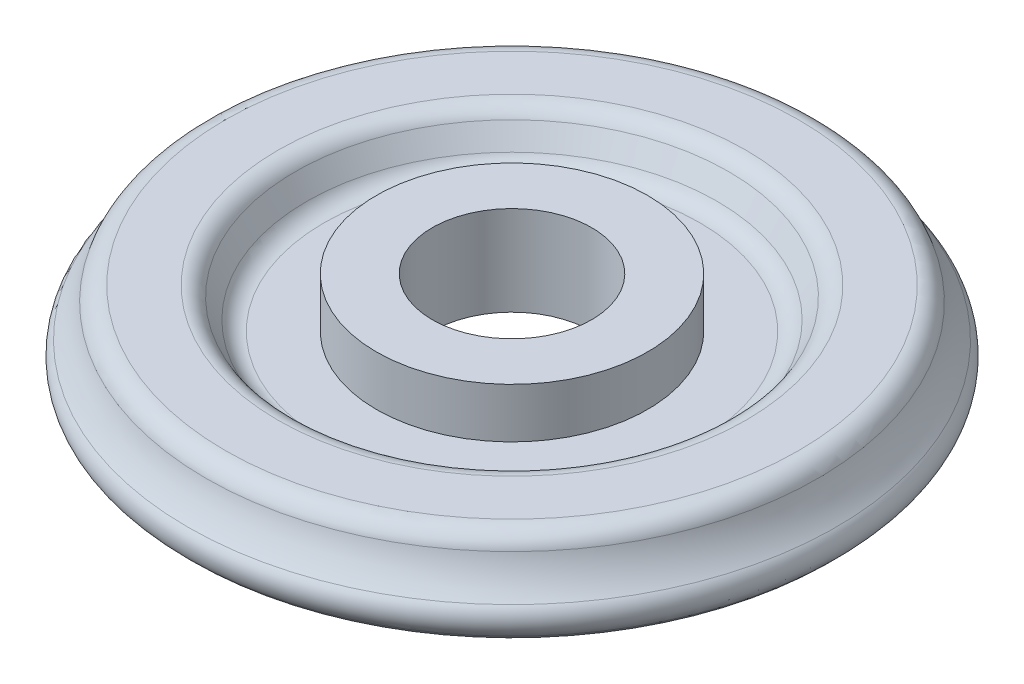
ISO-10303-21;
HEADER;
FILE_DESCRIPTION(('STEP AP214'),'2;1');
FILE_NAME('part.step','',(''),(''),'','','');
FILE_SCHEMA(('AUTOMOTIVE_DESIGN { 1 0 10303 214 1 1 1 1 }'));
ENDSEC;
DATA;
#1=APPLICATION_CONTEXT('core data for automotive mechanical design processes');
#2=APPLICATION_PROTOCOL_DEFINITION('international standard','automotive_design',2000,#1);
#3=PRODUCT_CONTEXT('',#1,'mechanical');
#4=PRODUCT('Part','Part','',(#3));
#5=PRODUCT_RELATED_PRODUCT_CATEGORY('part','',(#4));
#6=PRODUCT_DEFINITION_FORMATION('','',#4);
#7=PRODUCT_DEFINITION_CONTEXT('part definition',#1,'design');
#8=PRODUCT_DEFINITION('design','',#6,#7);
#9=PRODUCT_DEFINITION_SHAPE('','',#8);
#10=(LENGTH_UNIT() NAMED_UNIT(*) SI_UNIT(.MILLI.,.METRE.));
#11=(NAMED_UNIT(*) PLANE_ANGLE_UNIT() SI_UNIT($,.RADIAN.));
#12=(NAMED_UNIT(*) SI_UNIT($,.STERADIAN.) SOLID_ANGLE_UNIT());
#13=UNCERTAINTY_MEASURE_WITH_UNIT(LENGTH_MEASURE(1.E-05),#10,'distance_accuracy_value','');
#14=(GEOMETRIC_REPRESENTATION_CONTEXT(3) GLOBAL_UNCERTAINTY_ASSIGNED_CONTEXT((#13)) GLOBAL_UNIT_ASSIGNED_CONTEXT((#10,
#11,#12)) REPRESENTATION_CONTEXT('',''));
#15=CARTESIAN_POINT('',(0.,0.,0.));
#16=DIRECTION('',(0.,0.,1.));
#17=DIRECTION('',(1.,0.,0.));
#18=AXIS2_PLACEMENT_3D('',#15,#16,#17);
#19=CARTESIAN_POINT('',(0.,7.14375,0.));
#20=DIRECTION('',(0.,1.,0.));
#21=DIRECTION('',(0.,0.,1.));
#22=AXIS2_PLACEMENT_3D('',#19,#20,#21);
#23=PLANE('',#22);
#24=CARTESIAN_POINT('',(0.,7.14375,0.));
#25=DIRECTION('',(0.,1.,0.));
#26=DIRECTION('',(0.,0.,1.));
#27=AXIS2_PLACEMENT_3D('',#24,#25,#26);
#28=CIRCLE('',#27,10.795);
#29=CARTESIAN_POINT('',(0.,7.14375,10.795));
#30=VERTEX_POINT('',#29);
#31=EDGE_CURVE('E66',#30,#30,#28,.T.);
#32=ORIENTED_EDGE('',*,*,#31,.T.);
#33=EDGE_LOOP('',(#32));
#34=FACE_BOUND('',#33,.T.);
#35=CARTESIAN_POINT('',(0.,7.14375,0.));
#36=DIRECTION('',(0.,1.,0.));
#37=DIRECTION('',(0.,0.,1.));
#38=AXIS2_PLACEMENT_3D('',#35,#36,#37);
#39=CIRCLE('',#38,6.35);
#40=CARTESIAN_POINT('',(0.,7.14375,6.35));
#41=VERTEX_POINT('',#40);
#42=EDGE_CURVE('E72',#41,#41,#39,.T.);
#43=ORIENTED_EDGE('',*,*,#42,.F.);
#44=EDGE_LOOP('',(#43));
#45=FACE_BOUND('',#44,.T.);
#46=ADVANCED_FACE('F28',(#34,#45),#23,.T.);
#47=CARTESIAN_POINT('',(0.,0.,0.));
#48=DIRECTION('',(0.,1.,0.));
#49=DIRECTION('',(0.,0.,1.));
#50=AXIS2_PLACEMENT_3D('',#47,#48,#49);
#51=PLANE('',#50);
#52=CARTESIAN_POINT('',(0.,0.,0.));
#53=DIRECTION('',(0.,1.,0.));
#54=DIRECTION('',(0.,0.,1.));
#55=AXIS2_PLACEMENT_3D('',#52,#53,#54);
#56=CIRCLE('',#55,25.4);
#57=CARTESIAN_POINT('',(0.,0.,25.4));
#58=VERTEX_POINT('',#57);
#59=EDGE_CURVE('E63',#58,#58,#56,.T.);
#60=ORIENTED_EDGE('',*,*,#59,.F.);
#61=EDGE_LOOP('',(#60));
#62=FACE_BOUND('',#61,.T.);
#63=CARTESIAN_POINT('',(0.,0.,0.));
#64=DIRECTION('',(0.,1.,0.));
#65=DIRECTION('',(0.,0.,1.));
#66=AXIS2_PLACEMENT_3D('',#63,#64,#65);
#67=CIRCLE('',#66,6.35);
#68=CARTESIAN_POINT('',(0.,0.,6.35));
#69=VERTEX_POINT('',#68);
#70=EDGE_CURVE('E69',#69,#69,#67,.T.);
#71=ORIENTED_EDGE('',*,*,#70,.T.);
#72=EDGE_LOOP('',(#71));
#73=FACE_BOUND('',#72,.T.);
#74=ADVANCED_FACE('F79',(#62,#73),#51,.F.);
#75=CARTESIAN_POINT('',(0.,3.175,0.));
#76=DIRECTION('',(0.,-1.,0.));
#77=DIRECTION('',(0.,0.,-1.));
#78=AXIS2_PLACEMENT_3D('',#75,#76,#77);
#79=PLANE('',#78);
#80=CARTESIAN_POINT('',(0.,3.175,0.));
#81=DIRECTION('',(0.,-1.,0.));
#82=DIRECTION('',(0.,0.,-1.));
#83=AXIS2_PLACEMENT_3D('',#80,#81,#82);
#84=CIRCLE('',#83,14.9584564476615);
#85=CARTESIAN_POINT('',(0.,3.175,-14.9584564476615));
#86=VERTEX_POINT('',#85);
#87=EDGE_CURVE('E43',#86,#86,#84,.F.);
#88=ORIENTED_EDGE('',*,*,#87,.T.);
#89=EDGE_LOOP('',(#88));
#90=FACE_BOUND('',#89,.T.);
#91=CARTESIAN_POINT('',(0.,3.175,0.));
#92=DIRECTION('',(0.,-1.,0.));
#93=DIRECTION('',(0.,0.,-1.));
#94=AXIS2_PLACEMENT_3D('',#91,#92,#93);
#95=CIRCLE('',#94,10.795);
#96=CARTESIAN_POINT('',(0.,3.175,-10.795));
#97=VERTEX_POINT('',#96);
#98=EDGE_CURVE('E10',#97,#97,#95,.F.);
#99=ORIENTED_EDGE('',*,*,#98,.F.);
#100=EDGE_LOOP('',(#99));
#101=FACE_BOUND('',#100,.T.);
#102=ADVANCED_FACE('F85',(#90,#101),#79,.F.);
#103=CARTESIAN_POINT('',(0.,0.,0.));
#104=DIRECTION('',(0.,1.,0.));
#105=DIRECTION('',(0.,0.,1.));
#106=AXIS2_PLACEMENT_3D('',#103,#104,#105);
#107=CONICAL_SURFACE('',#106,25.4,0.785398163397446);
#108=CARTESIAN_POINT('',(0.,0.371975840456725,0.));
#109=DIRECTION('',(0.,-1.,0.));
#110=DIRECTION('',(0.,0.,-1.));
#111=AXIS2_PLACEMENT_3D('',#108,#109,#110);
#112=CIRCLE('',#111,25.7719758404567);
#113=CARTESIAN_POINT('',(0.,0.371975840456725,-25.7719758404567));
#114=VERTEX_POINT('',#113);
#115=EDGE_CURVE('E54',#114,#114,#112,.T.);
#116=ORIENTED_EDGE('',*,*,#115,.T.);
#117=EDGE_LOOP('',(#116));
#118=FACE_BOUND('',#117,.T.);
#119=ORIENTED_EDGE('',*,*,#59,.T.);
#120=EDGE_LOOP('',(#119));
#121=FACE_BOUND('',#120,.T.);
#122=ADVANCED_FACE('F96',(#118,#121),#107,.T.);
#123=CARTESIAN_POINT('',(0.,6.9068235829241,0.));
#124=DIRECTION('',(0.,1.,0.));
#125=DIRECTION('',(0.,0.,1.));
#126=AXIS2_PLACEMENT_3D('',#123,#124,#125);
#127=TOROIDAL_SURFACE('',#126,30.4555393048735,6.35);
#128=CARTESIAN_POINT('',(0.,2.57697100105712,0.));
#129=DIRECTION('',(0.,1.,0.));
#130=DIRECTION('',(0.,0.,1.));
#131=AXIS2_PLACEMENT_3D('',#128,#129,#130);
#132=CIRCLE('',#131,25.8106629212332);
#133=CARTESIAN_POINT('',(0.,2.57697100105712,25.8106629212332));
#134=VERTEX_POINT('',#133);
#135=EDGE_CURVE('E57',#134,#134,#132,.T.);
#136=ORIENTED_EDGE('',*,*,#135,.T.);
#137=EDGE_LOOP('',(#136));
#138=FACE_BOUND('',#137,.T.);
#139=CARTESIAN_POINT('',(0.,5.19136471658482,0.));
#140=DIRECTION('',(0.,1.,0.));
#141=DIRECTION('',(0.,0.,1.));
#142=AXIS2_PLACEMENT_3D('',#139,#140,#141);
#143=CIRCLE('',#142,24.3416452202579);
#144=CARTESIAN_POINT('',(0.,5.19136471658482,24.3416452202579));
#145=VERTEX_POINT('',#144);
#146=EDGE_CURVE('E60',#145,#145,#143,.F.);
#147=ORIENTED_EDGE('',*,*,#146,.T.);
#148=EDGE_LOOP('',(#147));
#149=FACE_BOUND('',#148,.T.);
#150=ADVANCED_FACE('F105',(#138,#149),#127,.F.);
#151=CARTESIAN_POINT('',(24.13,6.35,0.));
#152=DIRECTION('',(0.,-1.,0.));
#153=DIRECTION('',(0.,0.,-1.));
#154=AXIS2_PLACEMENT_3D('',#151,#152,#153);
#155=PLANE('',#154);
#156=CARTESIAN_POINT('',(0.,6.35,0.));
#157=DIRECTION('',(0.,-1.,0.));
#158=DIRECTION('',(0.,0.,-1.));
#159=AXIS2_PLACEMENT_3D('',#156,#157,#158);
#160=CIRCLE('',#159,22.813171699104);
#161=CARTESIAN_POINT('',(0.,6.35,-22.813171699104));
#162=VERTEX_POINT('',#161);
#163=EDGE_CURVE('E48',#162,#162,#160,.F.);
#164=ORIENTED_EDGE('',*,*,#163,.T.);
#165=EDGE_LOOP('',(#164));
#166=FACE_BOUND('',#165,.T.);
#167=CARTESIAN_POINT('',(0.,6.35,0.));
#168=DIRECTION('',(0.,-1.,0.));
#169=DIRECTION('',(0.,0.,-1.));
#170=AXIS2_PLACEMENT_3D('',#167,#168,#169);
#171=CIRCLE('',#170,18.6246306570156);
#172=CARTESIAN_POINT('',(0.,6.35,-18.6246306570156));
#173=VERTEX_POINT('',#172);
#174=EDGE_CURVE('E51',#173,#173,#171,.T.);
#175=ORIENTED_EDGE('',*,*,#174,.T.);
#176=EDGE_LOOP('',(#175));
#177=FACE_BOUND('',#176,.T.);
#178=ADVANCED_FACE('F102',(#166,#177),#155,.F.);
#179=CARTESIAN_POINT('',(0.,6.35,0.));
#180=DIRECTION('',(0.,1.,0.));
#181=DIRECTION('',(0.,0.,1.));
#182=AXIS2_PLACEMENT_3D('',#179,#180,#181);
#183=CONICAL_SURFACE('',#182,17.708087104677,0.523598775598296);
#184=CARTESIAN_POINT('',(0.,3.96875,0.));
#185=DIRECTION('',(0.,1.,0.));
#186=DIRECTION('',(0.,0.,1.));
#187=AXIS2_PLACEMENT_3D('',#184,#185,#186);
#188=CIRCLE('',#187,16.3332717761693);
#189=CARTESIAN_POINT('',(0.,3.96875,16.3332717761693));
#190=VERTEX_POINT('',#189);
#191=EDGE_CURVE('E35',#190,#190,#188,.F.);
#192=ORIENTED_EDGE('',*,*,#191,.T.);
#193=EDGE_LOOP('',(#192));
#194=FACE_BOUND('',#193,.T.);
#195=CARTESIAN_POINT('',(0.,5.55625,0.));
#196=DIRECTION('',(0.,-1.,0.));
#197=DIRECTION('',(0.,0.,-1.));
#198=AXIS2_PLACEMENT_3D('',#195,#196,#197);
#199=CIRCLE('',#198,17.2498153285078);
#200=CARTESIAN_POINT('',(0.,5.55625,-17.2498153285078));
#201=VERTEX_POINT('',#200);
#202=EDGE_CURVE('E39',#201,#201,#199,.F.);
#203=ORIENTED_EDGE('',*,*,#202,.T.);
#204=EDGE_LOOP('',(#203));
#205=FACE_BOUND('',#204,.T.);
#206=ADVANCED_FACE('F98',(#194,#205),#183,.F.);
#207=CARTESIAN_POINT('',(0.,1.49450785559037,0.));
#208=DIRECTION('',(0.,-1.,0.));
#209=DIRECTION('',(0.,0.,-1.));
#210=AXIS2_PLACEMENT_3D('',#207,#208,#209);
#211=TOROIDAL_SURFACE('',#210,24.6494438253231,1.5875);
#212=ORIENTED_EDGE('',*,*,#115,.F.);
#213=EDGE_LOOP('',(#212));
#214=FACE_BOUND('',#213,.T.);
#215=ORIENTED_EDGE('',*,*,#135,.F.);
#216=EDGE_LOOP('',(#215));
#217=FACE_BOUND('',#216,.T.);
#218=ADVANCED_FACE('F101',(#214,#217),#211,.T.);
#219=CARTESIAN_POINT('',(0.,4.7625,0.));
#220=DIRECTION('',(0.,1.,0.));
#221=DIRECTION('',(0.,0.,1.));
#222=AXIS2_PLACEMENT_3D('',#219,#220,#221);
#223=TOROIDAL_SURFACE('',#222,22.813171699104,1.5875);
#224=ORIENTED_EDGE('',*,*,#146,.F.);
#225=EDGE_LOOP('',(#224));
#226=FACE_BOUND('',#225,.T.);
#227=ORIENTED_EDGE('',*,*,#163,.F.);
#228=EDGE_LOOP('',(#227));
#229=FACE_BOUND('',#228,.T.);
#230=ADVANCED_FACE('F115',(#226,#229),#223,.T.);
#231=CARTESIAN_POINT('',(0.,4.7625,0.));
#232=DIRECTION('',(0.,-1.,0.));
#233=DIRECTION('',(0.,0.,-1.));
#234=AXIS2_PLACEMENT_3D('',#231,#232,#233);
#235=TOROIDAL_SURFACE('',#234,14.9584564476615,1.5875);
#236=ORIENTED_EDGE('',*,*,#191,.F.);
#237=EDGE_LOOP('',(#236));
#238=FACE_BOUND('',#237,.T.);
#239=ORIENTED_EDGE('',*,*,#87,.F.);
#240=EDGE_LOOP('',(#239));
#241=FACE_BOUND('',#240,.T.);
#242=ADVANCED_FACE('F118',(#238,#241),#235,.F.);
#243=CARTESIAN_POINT('',(0.,4.7625,0.));
#244=DIRECTION('',(0.,-1.,0.));
#245=DIRECTION('',(0.,0.,-1.));
#246=AXIS2_PLACEMENT_3D('',#243,#244,#245);
#247=TOROIDAL_SURFACE('',#246,18.6246306570156,1.5875);
#248=ORIENTED_EDGE('',*,*,#174,.F.);
#249=EDGE_LOOP('',(#248));
#250=FACE_BOUND('',#249,.T.);
#251=ORIENTED_EDGE('',*,*,#202,.F.);
#252=EDGE_LOOP('',(#251));
#253=FACE_BOUND('',#252,.T.);
#254=ADVANCED_FACE('F30',(#250,#253),#247,.T.);
#255=CARTESIAN_POINT('',(0.,7.14375,0.));
#256=DIRECTION('',(0.,-1.,0.));
#257=DIRECTION('',(0.,0.,-1.));
#258=AXIS2_PLACEMENT_3D('',#255,#256,#257);
#259=CYLINDRICAL_SURFACE('',#258,10.795);
#260=ORIENTED_EDGE('',*,*,#31,.F.);
#261=EDGE_LOOP('',(#260));
#262=FACE_BOUND('',#261,.T.);
#263=ORIENTED_EDGE('',*,*,#98,.T.);
#264=EDGE_LOOP('',(#263));
#265=FACE_BOUND('',#264,.T.);
#266=ADVANCED_FACE('F90',(#262,#265),#259,.T.);
#267=CARTESIAN_POINT('',(0.,6.35,0.));
#268=DIRECTION('',(0.,-1.,0.));
#269=DIRECTION('',(0.,0.,-1.));
#270=AXIS2_PLACEMENT_3D('',#267,#268,#269);
#271=CYLINDRICAL_SURFACE('',#270,6.35);
#272=ORIENTED_EDGE('',*,*,#70,.F.);
#273=EDGE_LOOP('',(#272));
#274=FACE_BOUND('',#273,.T.);
#275=ORIENTED_EDGE('',*,*,#42,.T.);
#276=EDGE_LOOP('',(#275));
#277=FACE_BOUND('',#276,.T.);
#278=ADVANCED_FACE('F76',(#274,#277),#271,.F.);
#279=CLOSED_SHELL('',(#46,#74,#102,#122,#150,#178,#206,#218,#230,#242,#254,#266,#278));
#280=MANIFOLD_SOLID_BREP('B2',#279);
#281=ADVANCED_BREP_SHAPE_REPRESENTATION('',(#18,#280),#14);
#282=SHAPE_DEFINITION_REPRESENTATION(#9,#281);
ENDSEC;
END-ISO-10303-21;
